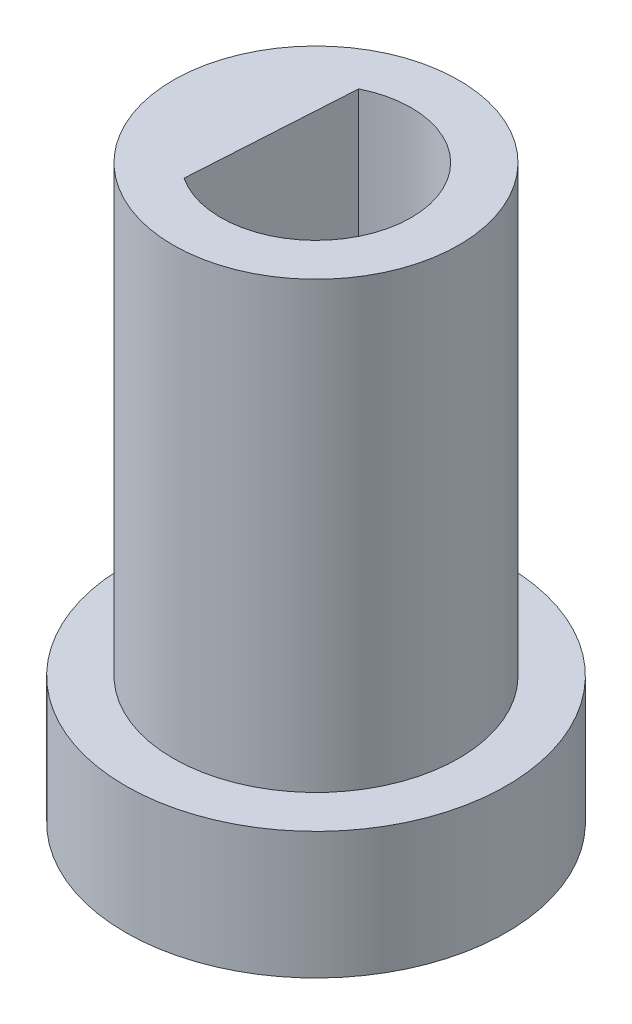
ISO-10303-21;
HEADER;
FILE_DESCRIPTION(('STEP AP214'),'2;1');
FILE_NAME('part.step','',(''),(''),'','','');
FILE_SCHEMA(('AUTOMOTIVE_DESIGN { 1 0 10303 214 1 1 1 1 }'));
ENDSEC;
DATA;
#1=APPLICATION_CONTEXT('core data for automotive mechanical design processes');
#2=APPLICATION_PROTOCOL_DEFINITION('international standard','automotive_design',2000,#1);
#3=PRODUCT_CONTEXT('',#1,'mechanical');
#4=PRODUCT('Part','Part','',(#3));
#5=PRODUCT_RELATED_PRODUCT_CATEGORY('part','',(#4));
#6=PRODUCT_DEFINITION_FORMATION('','',#4);
#7=PRODUCT_DEFINITION_CONTEXT('part definition',#1,'design');
#8=PRODUCT_DEFINITION('design','',#6,#7);
#9=PRODUCT_DEFINITION_SHAPE('','',#8);
#10=(LENGTH_UNIT() NAMED_UNIT(*) SI_UNIT(.MILLI.,.METRE.));
#11=(NAMED_UNIT(*) PLANE_ANGLE_UNIT() SI_UNIT($,.RADIAN.));
#12=(NAMED_UNIT(*) SI_UNIT($,.STERADIAN.) SOLID_ANGLE_UNIT());
#13=UNCERTAINTY_MEASURE_WITH_UNIT(LENGTH_MEASURE(1.E-05),#10,'distance_accuracy_value','');
#14=(GEOMETRIC_REPRESENTATION_CONTEXT(3) GLOBAL_UNCERTAINTY_ASSIGNED_CONTEXT((#13)) GLOBAL_UNIT_ASSIGNED_CONTEXT((#10,
#11,#12)) REPRESENTATION_CONTEXT('',''));
#15=CARTESIAN_POINT('',(0.,0.,0.));
#16=DIRECTION('',(0.,0.,1.));
#17=DIRECTION('',(1.,0.,0.));
#18=AXIS2_PLACEMENT_3D('',#15,#16,#17);
#19=CARTESIAN_POINT('',(0.,4.,0.));
#20=DIRECTION('',(0.,-1.,0.));
#21=DIRECTION('',(0.,0.,-1.));
#22=AXIS2_PLACEMENT_3D('',#19,#20,#21);
#23=CYLINDRICAL_SURFACE('',#22,6.);
#24=CARTESIAN_POINT('',(0.,4.,0.));
#25=DIRECTION('',(0.,1.,0.));
#26=DIRECTION('',(0.,0.,1.));
#27=AXIS2_PLACEMENT_3D('',#24,#25,#26);
#28=CIRCLE('',#27,6.);
#29=CARTESIAN_POINT('',(0.,4.,6.));
#30=VERTEX_POINT('',#29);
#31=EDGE_CURVE('E43',#30,#30,#28,.T.);
#32=ORIENTED_EDGE('',*,*,#31,.F.);
#33=EDGE_LOOP('',(#32));
#34=FACE_BOUND('',#33,.T.);
#35=CARTESIAN_POINT('',(0.,0.,0.));
#36=DIRECTION('',(0.,1.,0.));
#37=DIRECTION('',(0.,0.,1.));
#38=AXIS2_PLACEMENT_3D('',#35,#36,#37);
#39=CIRCLE('',#38,6.);
#40=CARTESIAN_POINT('',(0.,0.,6.));
#41=VERTEX_POINT('',#40);
#42=EDGE_CURVE('E38',#41,#41,#39,.T.);
#43=ORIENTED_EDGE('',*,*,#42,.T.);
#44=EDGE_LOOP('',(#43));
#45=FACE_BOUND('',#44,.T.);
#46=ADVANCED_FACE('F35',(#34,#45),#23,.T.);
#47=CARTESIAN_POINT('',(0.,4.,0.));
#48=DIRECTION('',(0.,1.,0.));
#49=DIRECTION('',(0.,0.,1.));
#50=AXIS2_PLACEMENT_3D('',#47,#48,#49);
#51=PLANE('',#50);
#52=CARTESIAN_POINT('',(0.,4.,0.));
#53=DIRECTION('',(0.,1.,0.));
#54=DIRECTION('',(0.,0.,1.));
#55=AXIS2_PLACEMENT_3D('',#52,#53,#54);
#56=CIRCLE('',#55,4.5);
#57=CARTESIAN_POINT('',(0.,4.,4.5));
#58=VERTEX_POINT('',#57);
#59=EDGE_CURVE('E11',#58,#58,#56,.T.);
#60=ORIENTED_EDGE('',*,*,#59,.F.);
#61=EDGE_LOOP('',(#60));
#62=FACE_BOUND('',#61,.T.);
#63=ORIENTED_EDGE('',*,*,#31,.T.);
#64=EDGE_LOOP('',(#63));
#65=FACE_BOUND('',#64,.T.);
#66=ADVANCED_FACE('F149',(#62,#65),#51,.T.);
#67=CARTESIAN_POINT('',(0.,0.,0.));
#68=DIRECTION('',(0.,1.,0.));
#69=DIRECTION('',(0.,0.,1.));
#70=AXIS2_PLACEMENT_3D('',#67,#68,#69);
#71=PLANE('',#70);
#72=DIRECTION('',(-1.,0.,0.));
#73=VECTOR('',#72,1.);
#74=CARTESIAN_POINT('',(-2.5,0.,2.5));
#75=LINE('',#74,#73);
#76=CARTESIAN_POINT('',(2.5,0.,2.5));
#77=VERTEX_POINT('',#76);
#78=CARTESIAN_POINT('',(-2.5,0.,2.5));
#79=VERTEX_POINT('',#78);
#80=EDGE_CURVE('E121',#77,#79,#75,.T.);
#81=ORIENTED_EDGE('',*,*,#80,.F.);
#82=DIRECTION('',(0.,0.,1.));
#83=VECTOR('',#82,1.);
#84=CARTESIAN_POINT('',(2.5,0.,-2.5));
#85=LINE('',#84,#83);
#86=CARTESIAN_POINT('',(2.5,0.,-2.5));
#87=VERTEX_POINT('',#86);
#88=EDGE_CURVE('E91',#87,#77,#85,.T.);
#89=ORIENTED_EDGE('',*,*,#88,.F.);
#90=DIRECTION('',(1.,0.,0.));
#91=VECTOR('',#90,1.);
#92=CARTESIAN_POINT('',(-2.5,0.,-2.5));
#93=LINE('',#92,#91);
#94=CARTESIAN_POINT('',(-2.5,0.,-2.5));
#95=VERTEX_POINT('',#94);
#96=EDGE_CURVE('E110',#95,#87,#93,.T.);
#97=ORIENTED_EDGE('',*,*,#96,.F.);
#98=DIRECTION('',(0.,0.,-1.));
#99=VECTOR('',#98,1.);
#100=CARTESIAN_POINT('',(-2.5,0.,-2.5));
#101=LINE('',#100,#99);
#102=EDGE_CURVE('E124',#79,#95,#101,.T.);
#103=ORIENTED_EDGE('',*,*,#102,.F.);
#104=EDGE_LOOP('',(#81,#89,#97,#103));
#105=FACE_BOUND('',#104,.T.);
#106=ORIENTED_EDGE('',*,*,#42,.F.);
#107=EDGE_LOOP('',(#106));
#108=FACE_BOUND('',#107,.T.);
#109=ADVANCED_FACE('F146',(#105,#108),#71,.F.);
#110=CARTESIAN_POINT('',(0.,18.,0.));
#111=DIRECTION('',(0.,-1.,0.));
#112=DIRECTION('',(0.,0.,-1.));
#113=AXIS2_PLACEMENT_3D('',#110,#111,#112);
#114=CYLINDRICAL_SURFACE('',#113,4.5);
#115=CARTESIAN_POINT('',(0.,18.,0.));
#116=DIRECTION('',(0.,1.,0.));
#117=DIRECTION('',(0.,0.,1.));
#118=AXIS2_PLACEMENT_3D('',#115,#116,#117);
#119=CIRCLE('',#118,4.5);
#120=CARTESIAN_POINT('',(0.,18.,4.5));
#121=VERTEX_POINT('',#120);
#122=EDGE_CURVE('E131',#121,#121,#119,.T.);
#123=ORIENTED_EDGE('',*,*,#122,.F.);
#124=EDGE_LOOP('',(#123));
#125=FACE_BOUND('',#124,.T.);
#126=ORIENTED_EDGE('',*,*,#59,.T.);
#127=EDGE_LOOP('',(#126));
#128=FACE_BOUND('',#127,.T.);
#129=ADVANCED_FACE('F148',(#125,#128),#114,.T.);
#130=CARTESIAN_POINT('',(0.,18.,0.));
#131=DIRECTION('',(0.,1.,0.));
#132=DIRECTION('',(0.,0.,1.));
#133=AXIS2_PLACEMENT_3D('',#130,#131,#132);
#134=PLANE('',#133);
#135=CARTESIAN_POINT('',(0.,18.,0.));
#136=DIRECTION('',(0.,1.,0.));
#137=DIRECTION('',(0.,0.,1.));
#138=AXIS2_PLACEMENT_3D('',#135,#136,#137);
#139=CIRCLE('',#138,3.);
#140=CARTESIAN_POINT('',(-1.65486068953235,18.,2.50228617432949));
#141=VERTEX_POINT('',#140);
#142=CARTESIAN_POINT('',(-1.33961304974174,18.,-2.684294484024));
#143=VERTEX_POINT('',#142);
#144=EDGE_CURVE('E55',#141,#143,#139,.T.);
#145=ORIENTED_EDGE('',*,*,#144,.F.);
#146=DIRECTION('',(-0.0606694365648359,0.,0.998157913091363));
#147=VECTOR('',#146,1.);
#148=CARTESIAN_POINT('',(-1.49723686963704,18.,-0.0910041548472538));
#149=LINE('',#148,#147);
#150=EDGE_CURVE('E100',#143,#141,#149,.T.);
#151=ORIENTED_EDGE('',*,*,#150,.F.);
#152=EDGE_LOOP('',(#145,#151));
#153=FACE_BOUND('',#152,.T.);
#154=ORIENTED_EDGE('',*,*,#122,.T.);
#155=EDGE_LOOP('',(#154));
#156=FACE_BOUND('',#155,.T.);
#157=ADVANCED_FACE('F155',(#153,#156),#134,.T.);
#158=CARTESIAN_POINT('',(2.5,4.,-2.5));
#159=DIRECTION('',(1.,0.,0.));
#160=DIRECTION('',(0.,0.,-1.));
#161=AXIS2_PLACEMENT_3D('',#158,#159,#160);
#162=PLANE('',#161);
#163=ORIENTED_EDGE('',*,*,#88,.T.);
#164=DIRECTION('',(0.,-1.,0.));
#165=VECTOR('',#164,1.);
#166=CARTESIAN_POINT('',(2.5,4.,2.5));
#167=LINE('',#166,#165);
#168=CARTESIAN_POINT('',(2.5,4.,2.5));
#169=VERTEX_POINT('',#168);
#170=EDGE_CURVE('E119',#169,#77,#167,.T.);
#171=ORIENTED_EDGE('',*,*,#170,.F.);
#172=DIRECTION('',(0.,0.,1.));
#173=VECTOR('',#172,1.);
#174=CARTESIAN_POINT('',(2.5,4.,-2.5));
#175=LINE('',#174,#173);
#176=CARTESIAN_POINT('',(2.5,4.,-2.5));
#177=VERTEX_POINT('',#176);
#178=EDGE_CURVE('E106',#177,#169,#175,.T.);
#179=ORIENTED_EDGE('',*,*,#178,.F.);
#180=DIRECTION('',(0.,-1.,0.));
#181=VECTOR('',#180,1.);
#182=CARTESIAN_POINT('',(2.5,4.,-2.5));
#183=LINE('',#182,#181);
#184=EDGE_CURVE('E129',#177,#87,#183,.T.);
#185=ORIENTED_EDGE('',*,*,#184,.T.);
#186=EDGE_LOOP('',(#163,#171,#179,#185));
#187=FACE_BOUND('',#186,.T.);
#188=ADVANCED_FACE('F186',(#187),#162,.F.);
#189=CARTESIAN_POINT('',(-2.5,4.,-2.5));
#190=DIRECTION('',(0.,0.,-1.));
#191=DIRECTION('',(-1.,0.,0.));
#192=AXIS2_PLACEMENT_3D('',#189,#190,#191);
#193=PLANE('',#192);
#194=ORIENTED_EDGE('',*,*,#96,.T.);
#195=ORIENTED_EDGE('',*,*,#184,.F.);
#196=DIRECTION('',(1.,0.,0.));
#197=VECTOR('',#196,1.);
#198=CARTESIAN_POINT('',(-2.5,4.,-2.5));
#199=LINE('',#198,#197);
#200=CARTESIAN_POINT('',(-2.5,4.,-2.5));
#201=VERTEX_POINT('',#200);
#202=EDGE_CURVE('E116',#201,#177,#199,.T.);
#203=ORIENTED_EDGE('',*,*,#202,.F.);
#204=DIRECTION('',(0.,-1.,0.));
#205=VECTOR('',#204,1.);
#206=CARTESIAN_POINT('',(-2.5,4.,-2.5));
#207=LINE('',#206,#205);
#208=EDGE_CURVE('E132',#201,#95,#207,.T.);
#209=ORIENTED_EDGE('',*,*,#208,.T.);
#210=EDGE_LOOP('',(#194,#195,#203,#209));
#211=FACE_BOUND('',#210,.T.);
#212=ADVANCED_FACE('F191',(#211),#193,.F.);
#213=CARTESIAN_POINT('',(-2.5,4.,-2.5));
#214=DIRECTION('',(-1.,0.,0.));
#215=DIRECTION('',(0.,0.,1.));
#216=AXIS2_PLACEMENT_3D('',#213,#214,#215);
#217=PLANE('',#216);
#218=ORIENTED_EDGE('',*,*,#102,.T.);
#219=ORIENTED_EDGE('',*,*,#208,.F.);
#220=DIRECTION('',(0.,0.,-1.));
#221=VECTOR('',#220,1.);
#222=CARTESIAN_POINT('',(-2.5,4.,-2.5));
#223=LINE('',#222,#221);
#224=CARTESIAN_POINT('',(-2.5,4.,2.5));
#225=VERTEX_POINT('',#224);
#226=EDGE_CURVE('E113',#225,#201,#223,.T.);
#227=ORIENTED_EDGE('',*,*,#226,.F.);
#228=DIRECTION('',(0.,-1.,0.));
#229=VECTOR('',#228,1.);
#230=CARTESIAN_POINT('',(-2.5,4.,2.5));
#231=LINE('',#230,#229);
#232=EDGE_CURVE('E134',#225,#79,#231,.T.);
#233=ORIENTED_EDGE('',*,*,#232,.T.);
#234=EDGE_LOOP('',(#218,#219,#227,#233));
#235=FACE_BOUND('',#234,.T.);
#236=ADVANCED_FACE('F201',(#235),#217,.F.);
#237=CARTESIAN_POINT('',(-2.5,4.,2.5));
#238=DIRECTION('',(0.,0.,1.));
#239=DIRECTION('',(1.,0.,0.));
#240=AXIS2_PLACEMENT_3D('',#237,#238,#239);
#241=PLANE('',#240);
#242=ORIENTED_EDGE('',*,*,#80,.T.);
#243=ORIENTED_EDGE('',*,*,#232,.F.);
#244=DIRECTION('',(-1.,0.,0.));
#245=VECTOR('',#244,1.);
#246=CARTESIAN_POINT('',(-2.5,4.,2.5));
#247=LINE('',#246,#245);
#248=EDGE_CURVE('E109',#169,#225,#247,.T.);
#249=ORIENTED_EDGE('',*,*,#248,.F.);
#250=ORIENTED_EDGE('',*,*,#170,.T.);
#251=EDGE_LOOP('',(#242,#243,#249,#250));
#252=FACE_BOUND('',#251,.T.);
#253=ADVANCED_FACE('F211',(#252),#241,.F.);
#254=CARTESIAN_POINT('',(0.,4.,0.));
#255=DIRECTION('',(0.,1.,0.));
#256=DIRECTION('',(0.,0.,1.));
#257=AXIS2_PLACEMENT_3D('',#254,#255,#256);
#258=PLANE('',#257);
#259=ORIENTED_EDGE('',*,*,#178,.T.);
#260=ORIENTED_EDGE('',*,*,#248,.T.);
#261=ORIENTED_EDGE('',*,*,#226,.T.);
#262=ORIENTED_EDGE('',*,*,#202,.T.);
#263=EDGE_LOOP('',(#259,#260,#261,#262));
#264=FACE_BOUND('',#263,.T.);
#265=ADVANCED_FACE('F221',(#264),#258,.F.);
#266=CARTESIAN_POINT('',(0.,8.,0.));
#267=DIRECTION('',(0.,1.,0.));
#268=DIRECTION('',(0.,0.,1.));
#269=AXIS2_PLACEMENT_3D('',#266,#267,#268);
#270=CYLINDRICAL_SURFACE('',#269,3.);
#271=ORIENTED_EDGE('',*,*,#144,.T.);
#272=DIRECTION('',(0.,-1.,0.));
#273=VECTOR('',#272,1.);
#274=CARTESIAN_POINT('',(-1.33961304974174,18.,-2.684294484024));
#275=LINE('',#274,#273);
#276=CARTESIAN_POINT('',(-1.33961304974174,8.,-2.684294484024));
#277=VERTEX_POINT('',#276);
#278=EDGE_CURVE('E93',#143,#277,#275,.T.);
#279=ORIENTED_EDGE('',*,*,#278,.T.);
#280=CARTESIAN_POINT('',(0.,8.,0.));
#281=DIRECTION('',(0.,1.,0.));
#282=DIRECTION('',(0.,0.,1.));
#283=AXIS2_PLACEMENT_3D('',#280,#281,#282);
#284=CIRCLE('',#283,3.);
#285=CARTESIAN_POINT('',(-1.65486068953235,8.,2.50228617432949));
#286=VERTEX_POINT('',#285);
#287=EDGE_CURVE('E87',#286,#277,#284,.T.);
#288=ORIENTED_EDGE('',*,*,#287,.F.);
#289=DIRECTION('',(0.,-1.,0.));
#290=VECTOR('',#289,1.);
#291=CARTESIAN_POINT('',(-1.65486068953235,18.,2.50228617432949));
#292=LINE('',#291,#290);
#293=EDGE_CURVE('E51',#141,#286,#292,.T.);
#294=ORIENTED_EDGE('',*,*,#293,.F.);
#295=EDGE_LOOP('',(#271,#279,#288,#294));
#296=FACE_BOUND('',#295,.T.);
#297=ADVANCED_FACE('F94',(#296),#270,.F.);
#298=CARTESIAN_POINT('',(0.,8.,0.));
#299=DIRECTION('',(0.,1.,0.));
#300=DIRECTION('',(0.,0.,1.));
#301=AXIS2_PLACEMENT_3D('',#298,#299,#300);
#302=PLANE('',#301);
#303=DIRECTION('',(-0.0606694365648359,0.,0.998157913091363));
#304=VECTOR('',#303,1.);
#305=CARTESIAN_POINT('',(-1.49723686963704,8.,-0.0910041548472538));
#306=LINE('',#305,#304);
#307=EDGE_CURVE('E90',#277,#286,#306,.T.);
#308=ORIENTED_EDGE('',*,*,#307,.T.);
#309=ORIENTED_EDGE('',*,*,#287,.T.);
#310=EDGE_LOOP('',(#308,#309));
#311=FACE_BOUND('',#310,.T.);
#312=ADVANCED_FACE('F88',(#311),#302,.T.);
#313=CARTESIAN_POINT('',(-1.49723686963704,18.,-0.0910041548472538));
#314=DIRECTION('',(0.998157913091363,0.,0.0606694365648359));
#315=DIRECTION('',(0.0606694365648359,0.,-0.998157913091363));
#316=AXIS2_PLACEMENT_3D('',#313,#314,#315);
#317=PLANE('',#316);
#318=ORIENTED_EDGE('',*,*,#307,.F.);
#319=ORIENTED_EDGE('',*,*,#278,.F.);
#320=ORIENTED_EDGE('',*,*,#150,.T.);
#321=ORIENTED_EDGE('',*,*,#293,.T.);
#322=EDGE_LOOP('',(#318,#319,#320,#321));
#323=FACE_BOUND('',#322,.T.);
#324=ADVANCED_FACE('F99',(#323),#317,.T.);
#325=CLOSED_SHELL('',(#46,#66,#109,#129,#157,#188,#212,#236,#253,#265,#297,#312,#324));
#326=MANIFOLD_SOLID_BREP('B2',#325);
#327=ADVANCED_BREP_SHAPE_REPRESENTATION('',(#18,#326),#14);
#328=SHAPE_DEFINITION_REPRESENTATION(#9,#327);
ENDSEC;
END-ISO-10303-21;
